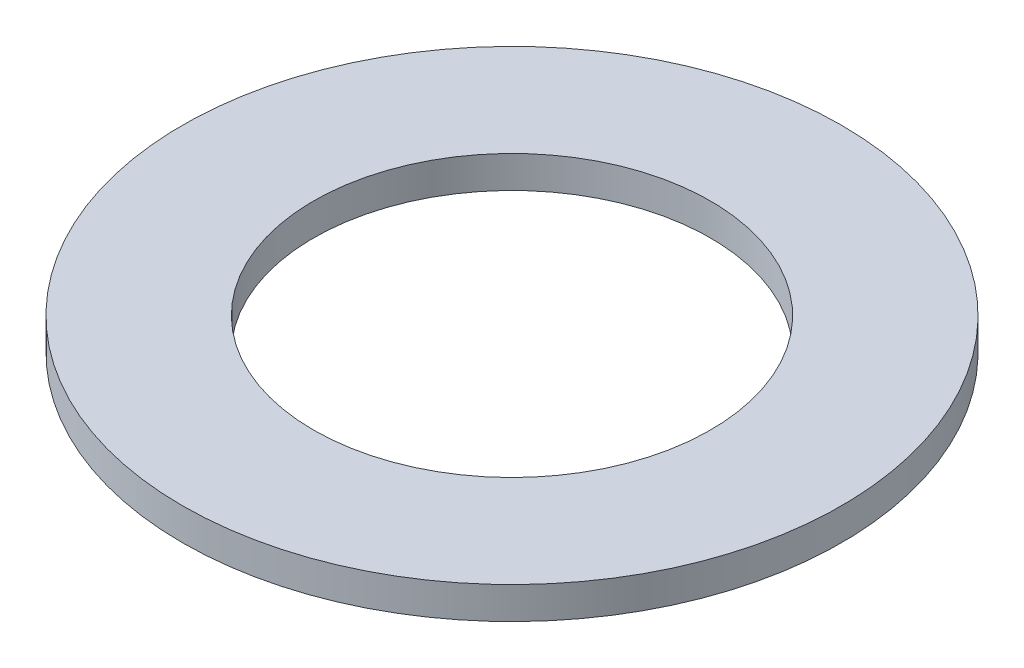
ISO-10303-21;
HEADER;
FILE_DESCRIPTION(('STEP AP214'),'2;1');
FILE_NAME('part.step','',(''),(''),'','','');
FILE_SCHEMA(('AUTOMOTIVE_DESIGN { 1 0 10303 214 1 1 1 1 }'));
ENDSEC;
DATA;
#1=APPLICATION_CONTEXT('core data for automotive mechanical design processes');
#2=APPLICATION_PROTOCOL_DEFINITION('international standard','automotive_design',2000,#1);
#3=PRODUCT_CONTEXT('',#1,'mechanical');
#4=PRODUCT('Part','Part','',(#3));
#5=PRODUCT_RELATED_PRODUCT_CATEGORY('part','',(#4));
#6=PRODUCT_DEFINITION_FORMATION('','',#4);
#7=PRODUCT_DEFINITION_CONTEXT('part definition',#1,'design');
#8=PRODUCT_DEFINITION('design','',#6,#7);
#9=PRODUCT_DEFINITION_SHAPE('','',#8);
#10=(LENGTH_UNIT() NAMED_UNIT(*) SI_UNIT(.MILLI.,.METRE.));
#11=(NAMED_UNIT(*) PLANE_ANGLE_UNIT() SI_UNIT($,.RADIAN.));
#12=(NAMED_UNIT(*) SI_UNIT($,.STERADIAN.) SOLID_ANGLE_UNIT());
#13=UNCERTAINTY_MEASURE_WITH_UNIT(LENGTH_MEASURE(1.E-05),#10,'distance_accuracy_value','');
#14=(GEOMETRIC_REPRESENTATION_CONTEXT(3) GLOBAL_UNCERTAINTY_ASSIGNED_CONTEXT((#13)) GLOBAL_UNIT_ASSIGNED_CONTEXT((#10,
#11,#12)) REPRESENTATION_CONTEXT('',''));
#15=CARTESIAN_POINT('',(0.,0.,0.));
#16=DIRECTION('',(0.,0.,1.));
#17=DIRECTION('',(1.,0.,0.));
#18=AXIS2_PLACEMENT_3D('',#15,#16,#17);
#19=CARTESIAN_POINT('',(0.,8.,0.));
#20=DIRECTION('',(0.,1.,0.));
#21=DIRECTION('',(0.,0.,1.));
#22=AXIS2_PLACEMENT_3D('',#19,#20,#21);
#23=PLANE('',#22);
#24=CARTESIAN_POINT('',(0.,8.,0.));
#25=DIRECTION('',(0.,1.,0.));
#26=DIRECTION('',(0.,0.,1.));
#27=AXIS2_PLACEMENT_3D('',#24,#25,#26);
#28=CIRCLE('',#27,82.2);
#29=CARTESIAN_POINT('',(0.,8.,82.2));
#30=VERTEX_POINT('',#29);
#31=EDGE_CURVE('E10',#30,#30,#28,.T.);
#32=ORIENTED_EDGE('',*,*,#31,.T.);
#33=EDGE_LOOP('',(#32));
#34=FACE_BOUND('',#33,.T.);
#35=CARTESIAN_POINT('',(0.,8.,0.));
#36=DIRECTION('',(0.,1.,0.));
#37=DIRECTION('',(0.,0.,1.));
#38=AXIS2_PLACEMENT_3D('',#35,#36,#37);
#39=CIRCLE('',#38,49.5);
#40=CARTESIAN_POINT('',(0.,8.,49.5));
#41=VERTEX_POINT('',#40);
#42=EDGE_CURVE('E44',#41,#41,#39,.T.);
#43=ORIENTED_EDGE('',*,*,#42,.F.);
#44=EDGE_LOOP('',(#43));
#45=FACE_BOUND('',#44,.T.);
#46=ADVANCED_FACE('F33',(#34,#45),#23,.T.);
#47=CARTESIAN_POINT('',(0.,0.,0.));
#48=DIRECTION('',(0.,1.,0.));
#49=DIRECTION('',(0.,0.,1.));
#50=AXIS2_PLACEMENT_3D('',#47,#48,#49);
#51=PLANE('',#50);
#52=CARTESIAN_POINT('',(0.,0.,0.));
#53=DIRECTION('',(0.,1.,0.));
#54=DIRECTION('',(0.,0.,1.));
#55=AXIS2_PLACEMENT_3D('',#52,#53,#54);
#56=CIRCLE('',#55,82.2);
#57=CARTESIAN_POINT('',(0.,0.,82.2));
#58=VERTEX_POINT('',#57);
#59=EDGE_CURVE('E37',#58,#58,#56,.T.);
#60=ORIENTED_EDGE('',*,*,#59,.F.);
#61=EDGE_LOOP('',(#60));
#62=FACE_BOUND('',#61,.T.);
#63=CARTESIAN_POINT('',(0.,0.,0.));
#64=DIRECTION('',(0.,1.,0.));
#65=DIRECTION('',(0.,0.,1.));
#66=AXIS2_PLACEMENT_3D('',#63,#64,#65);
#67=CIRCLE('',#66,49.5);
#68=CARTESIAN_POINT('',(0.,0.,49.5));
#69=VERTEX_POINT('',#68);
#70=EDGE_CURVE('E46',#69,#69,#67,.T.);
#71=ORIENTED_EDGE('',*,*,#70,.T.);
#72=EDGE_LOOP('',(#71));
#73=FACE_BOUND('',#72,.T.);
#74=ADVANCED_FACE('F56',(#62,#73),#51,.F.);
#75=CARTESIAN_POINT('',(0.,8.,0.));
#76=DIRECTION('',(0.,-1.,0.));
#77=DIRECTION('',(0.,0.,-1.));
#78=AXIS2_PLACEMENT_3D('',#75,#76,#77);
#79=CYLINDRICAL_SURFACE('',#78,82.2);
#80=ORIENTED_EDGE('',*,*,#31,.F.);
#81=EDGE_LOOP('',(#80));
#82=FACE_BOUND('',#81,.T.);
#83=ORIENTED_EDGE('',*,*,#59,.T.);
#84=EDGE_LOOP('',(#83));
#85=FACE_BOUND('',#84,.T.);
#86=ADVANCED_FACE('F35',(#82,#85),#79,.T.);
#87=CARTESIAN_POINT('',(0.,8.,0.));
#88=DIRECTION('',(0.,-1.,0.));
#89=DIRECTION('',(0.,0.,-1.));
#90=AXIS2_PLACEMENT_3D('',#87,#88,#89);
#91=CYLINDRICAL_SURFACE('',#90,49.5);
#92=ORIENTED_EDGE('',*,*,#42,.T.);
#93=EDGE_LOOP('',(#92));
#94=FACE_BOUND('',#93,.T.);
#95=ORIENTED_EDGE('',*,*,#70,.F.);
#96=EDGE_LOOP('',(#95));
#97=FACE_BOUND('',#96,.T.);
#98=ADVANCED_FACE('F52',(#94,#97),#91,.F.);
#99=CLOSED_SHELL('',(#46,#74,#86,#98));
#100=MANIFOLD_SOLID_BREP('B2',#99);
#101=ADVANCED_BREP_SHAPE_REPRESENTATION('',(#18,#100),#14);
#102=SHAPE_DEFINITION_REPRESENTATION(#9,#101);
ENDSEC;
END-ISO-10303-21;
